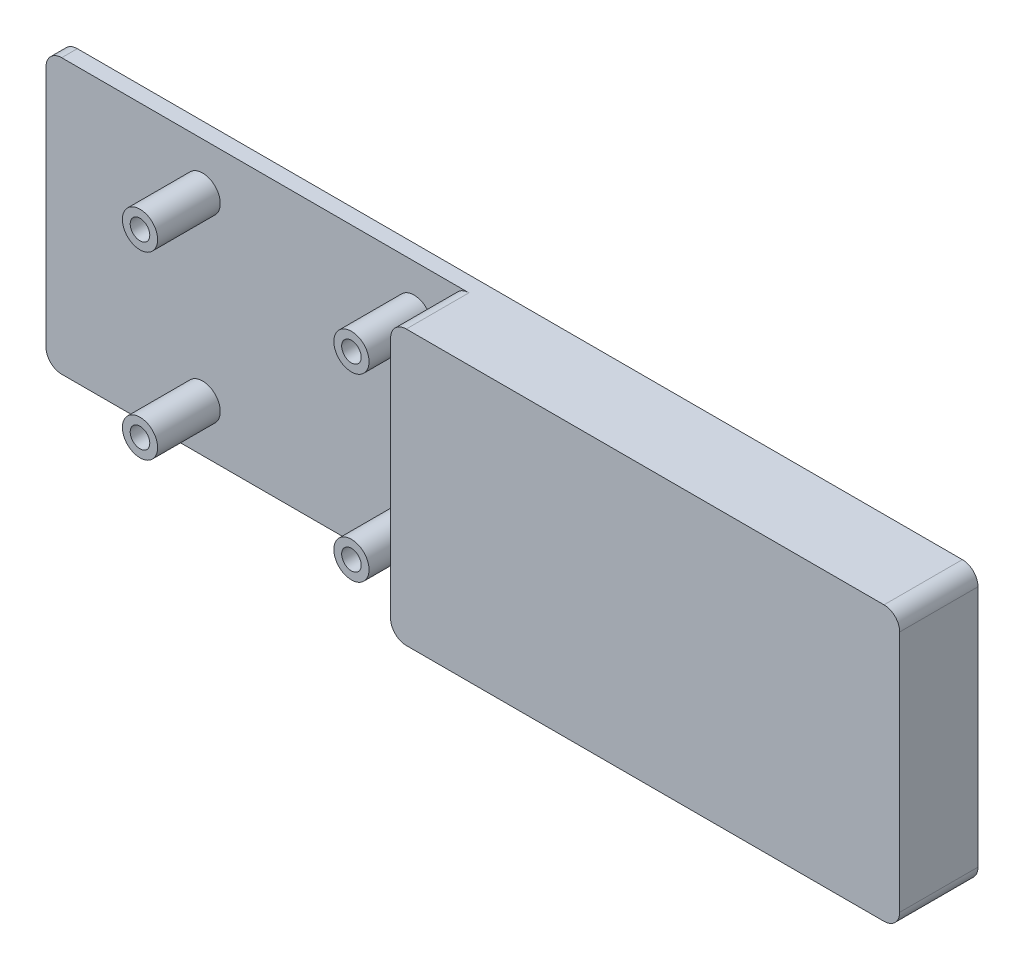
ISO-10303-21;
HEADER;
FILE_DESCRIPTION(('STEP AP214'),'2;1');
FILE_NAME('part.step','',(''),(''),'','','');
FILE_SCHEMA(('AUTOMOTIVE_DESIGN { 1 0 10303 214 1 1 1 1 }'));
ENDSEC;
DATA;
#1=APPLICATION_CONTEXT('core data for automotive mechanical design processes');
#2=APPLICATION_PROTOCOL_DEFINITION('international standard','automotive_design',2000,#1);
#3=PRODUCT_CONTEXT('',#1,'mechanical');
#4=PRODUCT('Part','Part','',(#3));
#5=PRODUCT_RELATED_PRODUCT_CATEGORY('part','',(#4));
#6=PRODUCT_DEFINITION_FORMATION('','',#4);
#7=PRODUCT_DEFINITION_CONTEXT('part definition',#1,'design');
#8=PRODUCT_DEFINITION('design','',#6,#7);
#9=PRODUCT_DEFINITION_SHAPE('','',#8);
#10=(LENGTH_UNIT() NAMED_UNIT(*) SI_UNIT(.MILLI.,.METRE.));
#11=(NAMED_UNIT(*) PLANE_ANGLE_UNIT() SI_UNIT($,.RADIAN.));
#12=(NAMED_UNIT(*) SI_UNIT($,.STERADIAN.) SOLID_ANGLE_UNIT());
#13=UNCERTAINTY_MEASURE_WITH_UNIT(LENGTH_MEASURE(1.E-05),#10,'distance_accuracy_value','');
#14=(GEOMETRIC_REPRESENTATION_CONTEXT(3) GLOBAL_UNCERTAINTY_ASSIGNED_CONTEXT((#13)) GLOBAL_UNIT_ASSIGNED_CONTEXT((#10,
#11,#12)) REPRESENTATION_CONTEXT('',''));
#15=CARTESIAN_POINT('',(0.,0.,0.));
#16=DIRECTION('',(0.,0.,1.));
#17=DIRECTION('',(1.,0.,0.));
#18=AXIS2_PLACEMENT_3D('',#15,#16,#17);
#19=CARTESIAN_POINT('',(0.,0.,2.));
#20=DIRECTION('',(0.,0.,1.));
#21=DIRECTION('',(1.,0.,0.));
#22=AXIS2_PLACEMENT_3D('',#19,#20,#21);
#23=PLANE('',#22);
#24=CARTESIAN_POINT('',(-38.5,11.5,2.));
#25=DIRECTION('',(0.,0.,1.));
#26=DIRECTION('',(1.,0.,0.));
#27=AXIS2_PLACEMENT_3D('',#24,#25,#26);
#28=CIRCLE('',#27,2.25);
#29=CARTESIAN_POINT('',(-36.25,11.5,2.));
#30=VERTEX_POINT('',#29);
#31=EDGE_CURVE('E250',#30,#30,#28,.F.);
#32=ORIENTED_EDGE('',*,*,#31,.T.);
#33=EDGE_LOOP('',(#32));
#34=FACE_BOUND('',#33,.T.);
#35=CARTESIAN_POINT('',(-11.5,11.5,2.));
#36=DIRECTION('',(0.,0.,1.));
#37=DIRECTION('',(1.,0.,0.));
#38=AXIS2_PLACEMENT_3D('',#35,#36,#37);
#39=CIRCLE('',#38,2.25);
#40=CARTESIAN_POINT('',(-9.25,11.5,2.));
#41=VERTEX_POINT('',#40);
#42=EDGE_CURVE('E259',#41,#41,#39,.F.);
#43=ORIENTED_EDGE('',*,*,#42,.T.);
#44=EDGE_LOOP('',(#43));
#45=FACE_BOUND('',#44,.T.);
#46=CARTESIAN_POINT('',(-11.5,-11.5,2.));
#47=DIRECTION('',(0.,0.,1.));
#48=DIRECTION('',(1.,0.,0.));
#49=AXIS2_PLACEMENT_3D('',#46,#47,#48);
#50=CIRCLE('',#49,2.25);
#51=CARTESIAN_POINT('',(-9.25,-11.5,2.));
#52=VERTEX_POINT('',#51);
#53=EDGE_CURVE('E271',#52,#52,#50,.F.);
#54=ORIENTED_EDGE('',*,*,#53,.T.);
#55=EDGE_LOOP('',(#54));
#56=FACE_BOUND('',#55,.T.);
#57=CARTESIAN_POINT('',(-38.5,-11.5,2.));
#58=DIRECTION('',(0.,0.,1.));
#59=DIRECTION('',(1.,0.,0.));
#60=AXIS2_PLACEMENT_3D('',#57,#58,#59);
#61=CIRCLE('',#60,2.25);
#62=CARTESIAN_POINT('',(-36.25,-11.5,2.));
#63=VERTEX_POINT('',#62);
#64=EDGE_CURVE('E179',#63,#63,#61,.T.);
#65=ORIENTED_EDGE('',*,*,#64,.F.);
#66=EDGE_LOOP('',(#65));
#67=FACE_BOUND('',#66,.T.);
#68=DIRECTION('',(-1.,0.,0.));
#69=VECTOR('',#68,1.);
#70=CARTESIAN_POINT('',(0.,17.5,2.));
#71=LINE('',#70,#69);
#72=CARTESIAN_POINT('',(-4.5,17.5,2.));
#73=VERTEX_POINT('',#72);
#74=CARTESIAN_POINT('',(-56.5,17.5,2.));
#75=VERTEX_POINT('',#74);
#76=EDGE_CURVE('E222',#73,#75,#71,.T.);
#77=ORIENTED_EDGE('',*,*,#76,.T.);
#78=CARTESIAN_POINT('',(-56.5,15.5,2.));
#79=DIRECTION('',(0.,0.,1.));
#80=DIRECTION('',(1.,0.,0.));
#81=AXIS2_PLACEMENT_3D('',#78,#79,#80);
#82=CIRCLE('',#81,2.);
#83=CARTESIAN_POINT('',(-58.5,15.5,2.));
#84=VERTEX_POINT('',#83);
#85=EDGE_CURVE('E81',#75,#84,#82,.T.);
#86=ORIENTED_EDGE('',*,*,#85,.T.);
#87=DIRECTION('',(0.,-1.,0.));
#88=VECTOR('',#87,1.);
#89=CARTESIAN_POINT('',(-58.5,0.,2.));
#90=LINE('',#89,#88);
#91=CARTESIAN_POINT('',(-58.5,-15.5,2.));
#92=VERTEX_POINT('',#91);
#93=EDGE_CURVE('E279',#84,#92,#90,.T.);
#94=ORIENTED_EDGE('',*,*,#93,.T.);
#95=CARTESIAN_POINT('',(-56.5,-15.5,2.));
#96=DIRECTION('',(0.,0.,1.));
#97=DIRECTION('',(1.,0.,0.));
#98=AXIS2_PLACEMENT_3D('',#95,#96,#97);
#99=CIRCLE('',#98,2.);
#100=CARTESIAN_POINT('',(-56.5,-17.5,2.));
#101=VERTEX_POINT('',#100);
#102=EDGE_CURVE('E219',#92,#101,#99,.T.);
#103=ORIENTED_EDGE('',*,*,#102,.T.);
#104=DIRECTION('',(-1.,0.,0.));
#105=VECTOR('',#104,1.);
#106=CARTESIAN_POINT('',(0.,-17.5,2.));
#107=LINE('',#106,#105);
#108=CARTESIAN_POINT('',(-4.5,-17.5,2.));
#109=VERTEX_POINT('',#108);
#110=EDGE_CURVE('E152',#109,#101,#107,.T.);
#111=ORIENTED_EDGE('',*,*,#110,.F.);
#112=CARTESIAN_POINT('',(-4.5,-15.5,2.));
#113=DIRECTION('',(0.,0.,1.));
#114=DIRECTION('',(1.,0.,0.));
#115=AXIS2_PLACEMENT_3D('',#112,#113,#114);
#116=CIRCLE('',#115,2.);
#117=CARTESIAN_POINT('',(-6.5,-15.5,2.));
#118=VERTEX_POINT('',#117);
#119=EDGE_CURVE('E12',#109,#118,#116,.F.);
#120=ORIENTED_EDGE('',*,*,#119,.T.);
#121=DIRECTION('',(0.,1.,0.));
#122=VECTOR('',#121,1.);
#123=CARTESIAN_POINT('',(-6.5,0.,2.));
#124=LINE('',#123,#122);
#125=CARTESIAN_POINT('',(-6.5,15.5,2.));
#126=VERTEX_POINT('',#125);
#127=EDGE_CURVE('E150',#118,#126,#124,.T.);
#128=ORIENTED_EDGE('',*,*,#127,.T.);
#129=CARTESIAN_POINT('',(-4.5,15.5,2.));
#130=DIRECTION('',(0.,0.,1.));
#131=DIRECTION('',(1.,0.,0.));
#132=AXIS2_PLACEMENT_3D('',#129,#130,#131);
#133=CIRCLE('',#132,2.);
#134=EDGE_CURVE('E67',#126,#73,#133,.F.);
#135=ORIENTED_EDGE('',*,*,#134,.T.);
#136=EDGE_LOOP('',(#77,#86,#94,#103,#111,#120,#128,#135));
#137=FACE_BOUND('',#136,.T.);
#138=ADVANCED_FACE('F59',(#34,#45,#56,#67,#137),#23,.T.);
#139=CARTESIAN_POINT('',(-38.5,-11.5,10.));
#140=DIRECTION('',(0.,0.,-1.));
#141=DIRECTION('',(-1.,0.,0.));
#142=AXIS2_PLACEMENT_3D('',#139,#140,#141);
#143=CYLINDRICAL_SURFACE('',#142,1.25);
#144=CARTESIAN_POINT('',(-38.5,-11.5,2.));
#145=DIRECTION('',(0.,0.,1.));
#146=DIRECTION('',(1.,0.,0.));
#147=AXIS2_PLACEMENT_3D('',#144,#145,#146);
#148=CIRCLE('',#147,1.25);
#149=CARTESIAN_POINT('',(-37.25,-11.5,2.));
#150=VERTEX_POINT('',#149);
#151=EDGE_CURVE('E277',#150,#150,#148,.T.);
#152=ORIENTED_EDGE('',*,*,#151,.F.);
#153=EDGE_LOOP('',(#152));
#154=FACE_BOUND('',#153,.T.);
#155=CARTESIAN_POINT('',(-38.5,-11.5,10.));
#156=DIRECTION('',(0.,0.,1.));
#157=DIRECTION('',(1.,0.,0.));
#158=AXIS2_PLACEMENT_3D('',#155,#156,#157);
#159=CIRCLE('',#158,1.25);
#160=CARTESIAN_POINT('',(-37.25,-11.5,10.));
#161=VERTEX_POINT('',#160);
#162=EDGE_CURVE('E295',#161,#161,#159,.T.);
#163=ORIENTED_EDGE('',*,*,#162,.T.);
#164=EDGE_LOOP('',(#163));
#165=FACE_BOUND('',#164,.T.);
#166=ADVANCED_FACE('F304',(#154,#165),#143,.F.);
#167=CARTESIAN_POINT('',(-38.5,-11.5,10.));
#168=DIRECTION('',(0.,0.,-1.));
#169=DIRECTION('',(-1.,0.,0.));
#170=AXIS2_PLACEMENT_3D('',#167,#168,#169);
#171=CYLINDRICAL_SURFACE('',#170,2.25);
#172=ORIENTED_EDGE('',*,*,#64,.T.);
#173=EDGE_LOOP('',(#172));
#174=FACE_BOUND('',#173,.T.);
#175=CARTESIAN_POINT('',(-38.5,-11.5,10.));
#176=DIRECTION('',(0.,0.,1.));
#177=DIRECTION('',(1.,0.,0.));
#178=AXIS2_PLACEMENT_3D('',#175,#176,#177);
#179=CIRCLE('',#178,2.25);
#180=CARTESIAN_POINT('',(-36.25,-11.5,10.));
#181=VERTEX_POINT('',#180);
#182=EDGE_CURVE('E294',#181,#181,#179,.T.);
#183=ORIENTED_EDGE('',*,*,#182,.F.);
#184=EDGE_LOOP('',(#183));
#185=FACE_BOUND('',#184,.T.);
#186=ADVANCED_FACE('F302',(#174,#185),#171,.T.);
#187=CARTESIAN_POINT('',(0.,0.,10.));
#188=DIRECTION('',(0.,0.,1.));
#189=DIRECTION('',(1.,0.,0.));
#190=AXIS2_PLACEMENT_3D('',#187,#188,#189);
#191=PLANE('',#190);
#192=ORIENTED_EDGE('',*,*,#162,.F.);
#193=EDGE_LOOP('',(#192));
#194=FACE_BOUND('',#193,.T.);
#195=ORIENTED_EDGE('',*,*,#182,.T.);
#196=EDGE_LOOP('',(#195));
#197=FACE_BOUND('',#196,.T.);
#198=ADVANCED_FACE('F300',(#194,#197),#191,.T.);
#199=CARTESIAN_POINT('',(0.,-17.5,2.));
#200=DIRECTION('',(0.,-1.,0.));
#201=DIRECTION('',(0.,0.,-1.));
#202=AXIS2_PLACEMENT_3D('',#199,#200,#201);
#203=PLANE('',#202);
#204=DIRECTION('',(-1.,0.,0.));
#205=VECTOR('',#204,1.);
#206=CARTESIAN_POINT('',(0.,-17.5,9.99999999999999));
#207=LINE('',#206,#205);
#208=CARTESIAN_POINT('',(56.5,-17.5,9.99999999999999));
#209=VERTEX_POINT('',#208);
#210=CARTESIAN_POINT('',(-4.5,-17.5,9.99999999999999));
#211=VERTEX_POINT('',#210);
#212=EDGE_CURVE('E240',#209,#211,#207,.T.);
#213=ORIENTED_EDGE('',*,*,#212,.T.);
#214=DIRECTION('',(0.,0.,-1.));
#215=VECTOR('',#214,1.);
#216=CARTESIAN_POINT('',(-4.5,-17.5,2.));
#217=LINE('',#216,#215);
#218=EDGE_CURVE('E200',#211,#109,#217,.T.);
#219=ORIENTED_EDGE('',*,*,#218,.T.);
#220=ORIENTED_EDGE('',*,*,#110,.T.);
#221=DIRECTION('',(0.,0.,-1.));
#222=VECTOR('',#221,1.);
#223=CARTESIAN_POINT('',(-56.5,-17.5,0.));
#224=LINE('',#223,#222);
#225=CARTESIAN_POINT('',(-56.5,-17.5,0.));
#226=VERTEX_POINT('',#225);
#227=EDGE_CURVE('E195',#101,#226,#224,.T.);
#228=ORIENTED_EDGE('',*,*,#227,.T.);
#229=DIRECTION('',(-1.,0.,0.));
#230=VECTOR('',#229,1.);
#231=CARTESIAN_POINT('',(0.,-17.5,0.));
#232=LINE('',#231,#230);
#233=CARTESIAN_POINT('',(56.5,-17.5,0.));
#234=VERTEX_POINT('',#233);
#235=EDGE_CURVE('E287',#234,#226,#232,.T.);
#236=ORIENTED_EDGE('',*,*,#235,.F.);
#237=DIRECTION('',(0.,0.,-1.));
#238=VECTOR('',#237,1.);
#239=CARTESIAN_POINT('',(56.5,-17.5,2.));
#240=LINE('',#239,#238);
#241=EDGE_CURVE('E198',#234,#209,#240,.F.);
#242=ORIENTED_EDGE('',*,*,#241,.T.);
#243=EDGE_LOOP('',(#213,#219,#220,#228,#236,#242));
#244=FACE_BOUND('',#243,.T.);
#245=ADVANCED_FACE('F311',(#244),#203,.T.);
#246=CARTESIAN_POINT('',(58.5,0.,2.));
#247=DIRECTION('',(1.,0.,0.));
#248=DIRECTION('',(0.,0.,-1.));
#249=AXIS2_PLACEMENT_3D('',#246,#247,#248);
#250=PLANE('',#249);
#251=DIRECTION('',(0.,-1.,0.));
#252=VECTOR('',#251,1.);
#253=CARTESIAN_POINT('',(58.5,0.,0.));
#254=LINE('',#253,#252);
#255=CARTESIAN_POINT('',(58.5,15.5,0.));
#256=VERTEX_POINT('',#255);
#257=CARTESIAN_POINT('',(58.5,-15.5,0.));
#258=VERTEX_POINT('',#257);
#259=EDGE_CURVE('E280',#256,#258,#254,.T.);
#260=ORIENTED_EDGE('',*,*,#259,.F.);
#261=DIRECTION('',(0.,0.,-1.));
#262=VECTOR('',#261,1.);
#263=CARTESIAN_POINT('',(58.5,15.5,9.99999999999999));
#264=LINE('',#263,#262);
#265=CARTESIAN_POINT('',(58.5,15.5,9.99999999999999));
#266=VERTEX_POINT('',#265);
#267=EDGE_CURVE('E213',#256,#266,#264,.F.);
#268=ORIENTED_EDGE('',*,*,#267,.T.);
#269=DIRECTION('',(0.,-1.,0.));
#270=VECTOR('',#269,1.);
#271=CARTESIAN_POINT('',(58.5,0.,9.99999999999999));
#272=LINE('',#271,#270);
#273=CARTESIAN_POINT('',(58.5,-15.5,9.99999999999999));
#274=VERTEX_POINT('',#273);
#275=EDGE_CURVE('E236',#266,#274,#272,.T.);
#276=ORIENTED_EDGE('',*,*,#275,.T.);
#277=DIRECTION('',(0.,0.,-1.));
#278=VECTOR('',#277,1.);
#279=CARTESIAN_POINT('',(58.5,-15.5,2.));
#280=LINE('',#279,#278);
#281=EDGE_CURVE('E210',#274,#258,#280,.T.);
#282=ORIENTED_EDGE('',*,*,#281,.T.);
#283=EDGE_LOOP('',(#260,#268,#276,#282));
#284=FACE_BOUND('',#283,.T.);
#285=ADVANCED_FACE('F478',(#284),#250,.T.);
#286=CARTESIAN_POINT('',(0.,17.5,2.));
#287=DIRECTION('',(0.,-1.,0.));
#288=DIRECTION('',(0.,0.,-1.));
#289=AXIS2_PLACEMENT_3D('',#286,#287,#288);
#290=PLANE('',#289);
#291=ORIENTED_EDGE('',*,*,#76,.F.);
#292=DIRECTION('',(0.,0.,-1.));
#293=VECTOR('',#292,1.);
#294=CARTESIAN_POINT('',(-4.5,17.5,2.));
#295=LINE('',#294,#293);
#296=CARTESIAN_POINT('',(-4.5,17.5,9.99999999999999));
#297=VERTEX_POINT('',#296);
#298=EDGE_CURVE('E186',#73,#297,#295,.F.);
#299=ORIENTED_EDGE('',*,*,#298,.T.);
#300=DIRECTION('',(-1.,0.,0.));
#301=VECTOR('',#300,1.);
#302=CARTESIAN_POINT('',(0.,17.5,9.99999999999999));
#303=LINE('',#302,#301);
#304=CARTESIAN_POINT('',(56.5,17.5,9.99999999999999));
#305=VERTEX_POINT('',#304);
#306=EDGE_CURVE('E230',#305,#297,#303,.T.);
#307=ORIENTED_EDGE('',*,*,#306,.F.);
#308=DIRECTION('',(0.,0.,-1.));
#309=VECTOR('',#308,1.);
#310=CARTESIAN_POINT('',(56.5,17.5,0.));
#311=LINE('',#310,#309);
#312=CARTESIAN_POINT('',(56.5,17.5,0.));
#313=VERTEX_POINT('',#312);
#314=EDGE_CURVE('E183',#305,#313,#311,.T.);
#315=ORIENTED_EDGE('',*,*,#314,.T.);
#316=DIRECTION('',(-1.,0.,0.));
#317=VECTOR('',#316,1.);
#318=CARTESIAN_POINT('',(0.,17.5,0.));
#319=LINE('',#318,#317);
#320=CARTESIAN_POINT('',(-56.5,17.5,0.));
#321=VERTEX_POINT('',#320);
#322=EDGE_CURVE('E274',#313,#321,#319,.T.);
#323=ORIENTED_EDGE('',*,*,#322,.T.);
#324=DIRECTION('',(0.,0.,-1.));
#325=VECTOR('',#324,1.);
#326=CARTESIAN_POINT('',(-56.5,17.5,2.));
#327=LINE('',#326,#325);
#328=EDGE_CURVE('E173',#321,#75,#327,.F.);
#329=ORIENTED_EDGE('',*,*,#328,.T.);
#330=EDGE_LOOP('',(#291,#299,#307,#315,#323,#329));
#331=FACE_BOUND('',#330,.T.);
#332=ADVANCED_FACE('F229',(#331),#290,.F.);
#333=CARTESIAN_POINT('',(-58.5,0.,2.));
#334=DIRECTION('',(1.,0.,0.));
#335=DIRECTION('',(0.,0.,-1.));
#336=AXIS2_PLACEMENT_3D('',#333,#334,#335);
#337=PLANE('',#336);
#338=ORIENTED_EDGE('',*,*,#93,.F.);
#339=DIRECTION('',(0.,0.,-1.));
#340=VECTOR('',#339,1.);
#341=CARTESIAN_POINT('',(-58.5,15.5,2.));
#342=LINE('',#341,#340);
#343=CARTESIAN_POINT('',(-58.5,15.5,0.));
#344=VERTEX_POINT('',#343);
#345=EDGE_CURVE('E216',#84,#344,#342,.T.);
#346=ORIENTED_EDGE('',*,*,#345,.T.);
#347=DIRECTION('',(0.,-1.,0.));
#348=VECTOR('',#347,1.);
#349=CARTESIAN_POINT('',(-58.5,0.,0.));
#350=LINE('',#349,#348);
#351=CARTESIAN_POINT('',(-58.5,-15.5,0.));
#352=VERTEX_POINT('',#351);
#353=EDGE_CURVE('E285',#344,#352,#350,.T.);
#354=ORIENTED_EDGE('',*,*,#353,.T.);
#355=DIRECTION('',(0.,0.,-1.));
#356=VECTOR('',#355,1.);
#357=CARTESIAN_POINT('',(-58.5,-15.5,2.));
#358=LINE('',#357,#356);
#359=EDGE_CURVE('E74',#352,#92,#358,.F.);
#360=ORIENTED_EDGE('',*,*,#359,.T.);
#361=EDGE_LOOP('',(#338,#346,#354,#360));
#362=FACE_BOUND('',#361,.T.);
#363=ADVANCED_FACE('F343',(#362),#337,.F.);
#364=CARTESIAN_POINT('',(0.,0.,0.));
#365=DIRECTION('',(0.,0.,1.));
#366=DIRECTION('',(1.,0.,0.));
#367=AXIS2_PLACEMENT_3D('',#364,#365,#366);
#368=PLANE('',#367);
#369=ORIENTED_EDGE('',*,*,#322,.F.);
#370=CARTESIAN_POINT('',(56.5,15.5,0.));
#371=DIRECTION('',(0.,0.,1.));
#372=DIRECTION('',(1.,0.,0.));
#373=AXIS2_PLACEMENT_3D('',#370,#371,#372);
#374=CIRCLE('',#373,2.);
#375=EDGE_CURVE('E208',#313,#256,#374,.F.);
#376=ORIENTED_EDGE('',*,*,#375,.T.);
#377=ORIENTED_EDGE('',*,*,#259,.T.);
#378=CARTESIAN_POINT('',(56.5,-15.5,0.));
#379=DIRECTION('',(0.,0.,1.));
#380=DIRECTION('',(1.,0.,0.));
#381=AXIS2_PLACEMENT_3D('',#378,#379,#380);
#382=CIRCLE('',#381,2.);
#383=EDGE_CURVE('E206',#258,#234,#382,.F.);
#384=ORIENTED_EDGE('',*,*,#383,.T.);
#385=ORIENTED_EDGE('',*,*,#235,.T.);
#386=CARTESIAN_POINT('',(-56.5,-15.5,0.));
#387=DIRECTION('',(0.,0.,1.));
#388=DIRECTION('',(1.,0.,0.));
#389=AXIS2_PLACEMENT_3D('',#386,#387,#388);
#390=CIRCLE('',#389,2.);
#391=EDGE_CURVE('E202',#226,#352,#390,.F.);
#392=ORIENTED_EDGE('',*,*,#391,.T.);
#393=ORIENTED_EDGE('',*,*,#353,.F.);
#394=CARTESIAN_POINT('',(-56.5,15.5,0.));
#395=DIRECTION('',(0.,0.,1.));
#396=DIRECTION('',(1.,0.,0.));
#397=AXIS2_PLACEMENT_3D('',#394,#395,#396);
#398=CIRCLE('',#397,2.);
#399=EDGE_CURVE('E204',#344,#321,#398,.F.);
#400=ORIENTED_EDGE('',*,*,#399,.T.);
#401=EDGE_LOOP('',(#369,#376,#377,#384,#385,#392,#393,#400));
#402=FACE_BOUND('',#401,.T.);
#403=ADVANCED_FACE('F334',(#402),#368,.F.);
#404=ORIENTED_EDGE('',*,*,#151,.T.);
#405=EDGE_LOOP('',(#404));
#406=FACE_BOUND('',#405,.T.);
#407=ADVANCED_FACE('F322',(#406),#23,.T.);
#408=CARTESIAN_POINT('',(-11.5,-11.5,10.));
#409=DIRECTION('',(0.,0.,-1.));
#410=DIRECTION('',(-1.,0.,0.));
#411=AXIS2_PLACEMENT_3D('',#408,#409,#410);
#412=CYLINDRICAL_SURFACE('',#411,1.25);
#413=CARTESIAN_POINT('',(-11.5,-11.5,2.));
#414=DIRECTION('',(0.,0.,1.));
#415=DIRECTION('',(1.,0.,0.));
#416=AXIS2_PLACEMENT_3D('',#413,#414,#415);
#417=CIRCLE('',#416,1.25);
#418=CARTESIAN_POINT('',(-10.25,-11.5,2.));
#419=VERTEX_POINT('',#418);
#420=EDGE_CURVE('E265',#419,#419,#417,.F.);
#421=ORIENTED_EDGE('',*,*,#420,.T.);
#422=EDGE_LOOP('',(#421));
#423=FACE_BOUND('',#422,.T.);
#424=CARTESIAN_POINT('',(-11.5,-11.5,10.));
#425=DIRECTION('',(0.,0.,1.));
#426=DIRECTION('',(1.,0.,0.));
#427=AXIS2_PLACEMENT_3D('',#424,#425,#426);
#428=CIRCLE('',#427,1.25);
#429=CARTESIAN_POINT('',(-10.25,-11.5,10.));
#430=VERTEX_POINT('',#429);
#431=EDGE_CURVE('E262',#430,#430,#428,.T.);
#432=ORIENTED_EDGE('',*,*,#431,.T.);
#433=EDGE_LOOP('',(#432));
#434=FACE_BOUND('',#433,.T.);
#435=ADVANCED_FACE('F333',(#423,#434),#412,.F.);
#436=CARTESIAN_POINT('',(-11.5,-11.5,10.));
#437=DIRECTION('',(0.,0.,-1.));
#438=DIRECTION('',(-1.,0.,0.));
#439=AXIS2_PLACEMENT_3D('',#436,#437,#438);
#440=CYLINDRICAL_SURFACE('',#439,2.25);
#441=ORIENTED_EDGE('',*,*,#53,.F.);
#442=EDGE_LOOP('',(#441));
#443=FACE_BOUND('',#442,.T.);
#444=CARTESIAN_POINT('',(-11.5,-11.5,10.));
#445=DIRECTION('',(0.,0.,1.));
#446=DIRECTION('',(1.,0.,0.));
#447=AXIS2_PLACEMENT_3D('',#444,#445,#446);
#448=CIRCLE('',#447,2.25);
#449=CARTESIAN_POINT('',(-9.25,-11.5,10.));
#450=VERTEX_POINT('',#449);
#451=EDGE_CURVE('E268',#450,#450,#448,.T.);
#452=ORIENTED_EDGE('',*,*,#451,.F.);
#453=EDGE_LOOP('',(#452));
#454=FACE_BOUND('',#453,.T.);
#455=ADVANCED_FACE('F341',(#443,#454),#440,.T.);
#456=CARTESIAN_POINT('',(0.,0.,10.));
#457=DIRECTION('',(0.,0.,1.));
#458=DIRECTION('',(1.,0.,0.));
#459=AXIS2_PLACEMENT_3D('',#456,#457,#458);
#460=PLANE('',#459);
#461=ORIENTED_EDGE('',*,*,#431,.F.);
#462=EDGE_LOOP('',(#461));
#463=FACE_BOUND('',#462,.T.);
#464=ORIENTED_EDGE('',*,*,#451,.T.);
#465=EDGE_LOOP('',(#464));
#466=FACE_BOUND('',#465,.T.);
#467=ADVANCED_FACE('F347',(#463,#466),#460,.T.);
#468=ORIENTED_EDGE('',*,*,#420,.F.);
#469=EDGE_LOOP('',(#468));
#470=FACE_BOUND('',#469,.T.);
#471=ADVANCED_FACE('F336',(#470),#23,.T.);
#472=CARTESIAN_POINT('',(-11.5,11.5,10.));
#473=DIRECTION('',(0.,0.,-1.));
#474=DIRECTION('',(-1.,0.,0.));
#475=AXIS2_PLACEMENT_3D('',#472,#473,#474);
#476=CYLINDRICAL_SURFACE('',#475,1.25);
#477=CARTESIAN_POINT('',(-11.5,11.5,2.));
#478=DIRECTION('',(0.,0.,1.));
#479=DIRECTION('',(1.,0.,0.));
#480=AXIS2_PLACEMENT_3D('',#477,#478,#479);
#481=CIRCLE('',#480,1.25);
#482=CARTESIAN_POINT('',(-10.25,11.5,2.));
#483=VERTEX_POINT('',#482);
#484=EDGE_CURVE('E176',#483,#483,#481,.F.);
#485=ORIENTED_EDGE('',*,*,#484,.T.);
#486=EDGE_LOOP('',(#485));
#487=FACE_BOUND('',#486,.T.);
#488=CARTESIAN_POINT('',(-11.5,11.5,10.));
#489=DIRECTION('',(0.,0.,1.));
#490=DIRECTION('',(1.,0.,0.));
#491=AXIS2_PLACEMENT_3D('',#488,#489,#490);
#492=CIRCLE('',#491,1.25);
#493=CARTESIAN_POINT('',(-10.25,11.5,10.));
#494=VERTEX_POINT('',#493);
#495=EDGE_CURVE('E252',#494,#494,#492,.T.);
#496=ORIENTED_EDGE('',*,*,#495,.T.);
#497=EDGE_LOOP('',(#496));
#498=FACE_BOUND('',#497,.T.);
#499=ADVANCED_FACE('F346',(#487,#498),#476,.F.);
#500=CARTESIAN_POINT('',(-11.5,11.5,10.));
#501=DIRECTION('',(0.,0.,-1.));
#502=DIRECTION('',(-1.,0.,0.));
#503=AXIS2_PLACEMENT_3D('',#500,#501,#502);
#504=CYLINDRICAL_SURFACE('',#503,2.25);
#505=ORIENTED_EDGE('',*,*,#42,.F.);
#506=EDGE_LOOP('',(#505));
#507=FACE_BOUND('',#506,.T.);
#508=CARTESIAN_POINT('',(-11.5,11.5,10.));
#509=DIRECTION('',(0.,0.,1.));
#510=DIRECTION('',(1.,0.,0.));
#511=AXIS2_PLACEMENT_3D('',#508,#509,#510);
#512=CIRCLE('',#511,2.25);
#513=CARTESIAN_POINT('',(-9.25,11.5,10.));
#514=VERTEX_POINT('',#513);
#515=EDGE_CURVE('E256',#514,#514,#512,.T.);
#516=ORIENTED_EDGE('',*,*,#515,.F.);
#517=EDGE_LOOP('',(#516));
#518=FACE_BOUND('',#517,.T.);
#519=ADVANCED_FACE('F353',(#507,#518),#504,.T.);
#520=CARTESIAN_POINT('',(0.,0.,10.));
#521=DIRECTION('',(0.,0.,1.));
#522=DIRECTION('',(1.,0.,0.));
#523=AXIS2_PLACEMENT_3D('',#520,#521,#522);
#524=PLANE('',#523);
#525=ORIENTED_EDGE('',*,*,#495,.F.);
#526=EDGE_LOOP('',(#525));
#527=FACE_BOUND('',#526,.T.);
#528=ORIENTED_EDGE('',*,*,#515,.T.);
#529=EDGE_LOOP('',(#528));
#530=FACE_BOUND('',#529,.T.);
#531=ADVANCED_FACE('F361',(#527,#530),#524,.T.);
#532=ORIENTED_EDGE('',*,*,#484,.F.);
#533=EDGE_LOOP('',(#532));
#534=FACE_BOUND('',#533,.T.);
#535=ADVANCED_FACE('F331',(#534),#23,.T.);
#536=CARTESIAN_POINT('',(-38.5,11.5,10.));
#537=DIRECTION('',(0.,0.,-1.));
#538=DIRECTION('',(-1.,0.,0.));
#539=AXIS2_PLACEMENT_3D('',#536,#537,#538);
#540=CYLINDRICAL_SURFACE('',#539,1.25);
#541=CARTESIAN_POINT('',(-38.5,11.5,2.));
#542=DIRECTION('',(0.,0.,1.));
#543=DIRECTION('',(1.,0.,0.));
#544=AXIS2_PLACEMENT_3D('',#541,#542,#543);
#545=CIRCLE('',#544,1.25);
#546=CARTESIAN_POINT('',(-37.25,11.5,2.));
#547=VERTEX_POINT('',#546);
#548=EDGE_CURVE('E171',#547,#547,#545,.F.);
#549=ORIENTED_EDGE('',*,*,#548,.T.);
#550=EDGE_LOOP('',(#549));
#551=FACE_BOUND('',#550,.T.);
#552=CARTESIAN_POINT('',(-38.5,11.5,10.));
#553=DIRECTION('',(0.,0.,1.));
#554=DIRECTION('',(1.,0.,0.));
#555=AXIS2_PLACEMENT_3D('',#552,#553,#554);
#556=CIRCLE('',#555,1.25);
#557=CARTESIAN_POINT('',(-37.25,11.5,10.));
#558=VERTEX_POINT('',#557);
#559=EDGE_CURVE('E165',#558,#558,#556,.T.);
#560=ORIENTED_EDGE('',*,*,#559,.T.);
#561=EDGE_LOOP('',(#560));
#562=FACE_BOUND('',#561,.T.);
#563=ADVANCED_FACE('F360',(#551,#562),#540,.F.);
#564=CARTESIAN_POINT('',(-38.5,11.5,10.));
#565=DIRECTION('',(0.,0.,-1.));
#566=DIRECTION('',(-1.,0.,0.));
#567=AXIS2_PLACEMENT_3D('',#564,#565,#566);
#568=CYLINDRICAL_SURFACE('',#567,2.25);
#569=ORIENTED_EDGE('',*,*,#31,.F.);
#570=EDGE_LOOP('',(#569));
#571=FACE_BOUND('',#570,.T.);
#572=CARTESIAN_POINT('',(-38.5,11.5,10.));
#573=DIRECTION('',(0.,0.,1.));
#574=DIRECTION('',(1.,0.,0.));
#575=AXIS2_PLACEMENT_3D('',#572,#573,#574);
#576=CIRCLE('',#575,2.25);
#577=CARTESIAN_POINT('',(-36.25,11.5,10.));
#578=VERTEX_POINT('',#577);
#579=EDGE_CURVE('E247',#578,#578,#576,.T.);
#580=ORIENTED_EDGE('',*,*,#579,.F.);
#581=EDGE_LOOP('',(#580));
#582=FACE_BOUND('',#581,.T.);
#583=ADVANCED_FACE('F367',(#571,#582),#568,.T.);
#584=CARTESIAN_POINT('',(0.,0.,10.));
#585=DIRECTION('',(0.,0.,1.));
#586=DIRECTION('',(1.,0.,0.));
#587=AXIS2_PLACEMENT_3D('',#584,#585,#586);
#588=PLANE('',#587);
#589=ORIENTED_EDGE('',*,*,#559,.F.);
#590=EDGE_LOOP('',(#589));
#591=FACE_BOUND('',#590,.T.);
#592=ORIENTED_EDGE('',*,*,#579,.T.);
#593=EDGE_LOOP('',(#592));
#594=FACE_BOUND('',#593,.T.);
#595=ADVANCED_FACE('F329',(#591,#594),#588,.T.);
#596=ORIENTED_EDGE('',*,*,#548,.F.);
#597=EDGE_LOOP('',(#596));
#598=FACE_BOUND('',#597,.T.);
#599=ADVANCED_FACE('F321',(#598),#23,.T.);
#600=CARTESIAN_POINT('',(-6.5,0.,83.824115301167));
#601=DIRECTION('',(1.,0.,0.));
#602=DIRECTION('',(0.,1.,0.));
#603=AXIS2_PLACEMENT_3D('',#600,#601,#602);
#604=PLANE('',#603);
#605=DIRECTION('',(0.,-1.,0.));
#606=VECTOR('',#605,1.);
#607=CARTESIAN_POINT('',(-6.5,0.,9.99999999999999));
#608=LINE('',#607,#606);
#609=CARTESIAN_POINT('',(-6.5,15.5,9.99999999999999));
#610=VERTEX_POINT('',#609);
#611=CARTESIAN_POINT('',(-6.5,-15.5,9.99999999999999));
#612=VERTEX_POINT('',#611);
#613=EDGE_CURVE('E166',#610,#612,#608,.T.);
#614=ORIENTED_EDGE('',*,*,#613,.F.);
#615=DIRECTION('',(0.,0.,-1.));
#616=VECTOR('',#615,1.);
#617=CARTESIAN_POINT('',(-6.5,15.5,83.824115301167));
#618=LINE('',#617,#616);
#619=EDGE_CURVE('E164',#610,#126,#618,.T.);
#620=ORIENTED_EDGE('',*,*,#619,.T.);
#621=ORIENTED_EDGE('',*,*,#127,.F.);
#622=DIRECTION('',(0.,0.,-1.));
#623=VECTOR('',#622,1.);
#624=CARTESIAN_POINT('',(-6.5,-15.5,9.99999999999999));
#625=LINE('',#624,#623);
#626=EDGE_CURVE('E161',#118,#612,#625,.F.);
#627=ORIENTED_EDGE('',*,*,#626,.T.);
#628=EDGE_LOOP('',(#614,#620,#621,#627));
#629=FACE_BOUND('',#628,.T.);
#630=ADVANCED_FACE('F160',(#629),#604,.F.);
#631=CARTESIAN_POINT('',(0.,0.,10.));
#632=DIRECTION('',(0.,0.,1.));
#633=DIRECTION('',(1.,0.,0.));
#634=AXIS2_PLACEMENT_3D('',#631,#632,#633);
#635=PLANE('',#634);
#636=ORIENTED_EDGE('',*,*,#306,.T.);
#637=CARTESIAN_POINT('',(-4.5,15.5,9.99999999999999));
#638=DIRECTION('',(0.,0.,1.));
#639=DIRECTION('',(1.,0.,0.));
#640=AXIS2_PLACEMENT_3D('',#637,#638,#639);
#641=CIRCLE('',#640,2.);
#642=EDGE_CURVE('E193',#297,#610,#641,.T.);
#643=ORIENTED_EDGE('',*,*,#642,.T.);
#644=ORIENTED_EDGE('',*,*,#613,.T.);
#645=CARTESIAN_POINT('',(-4.5,-15.5,10.));
#646=DIRECTION('',(0.,0.,1.));
#647=DIRECTION('',(1.,0.,0.));
#648=AXIS2_PLACEMENT_3D('',#645,#646,#647);
#649=CIRCLE('',#648,2.);
#650=EDGE_CURVE('E170',#612,#211,#649,.T.);
#651=ORIENTED_EDGE('',*,*,#650,.T.);
#652=ORIENTED_EDGE('',*,*,#212,.F.);
#653=CARTESIAN_POINT('',(56.5,-15.5,10.));
#654=DIRECTION('',(0.,0.,1.));
#655=DIRECTION('',(1.,0.,0.));
#656=AXIS2_PLACEMENT_3D('',#653,#654,#655);
#657=CIRCLE('',#656,2.);
#658=EDGE_CURVE('E188',#209,#274,#657,.T.);
#659=ORIENTED_EDGE('',*,*,#658,.T.);
#660=ORIENTED_EDGE('',*,*,#275,.F.);
#661=CARTESIAN_POINT('',(56.5,15.5,10.));
#662=DIRECTION('',(0.,0.,1.));
#663=DIRECTION('',(1.,0.,0.));
#664=AXIS2_PLACEMENT_3D('',#661,#662,#663);
#665=CIRCLE('',#664,2.);
#666=EDGE_CURVE('E190',#266,#305,#665,.T.);
#667=ORIENTED_EDGE('',*,*,#666,.T.);
#668=EDGE_LOOP('',(#636,#643,#644,#651,#652,#659,#660,#667));
#669=FACE_BOUND('',#668,.T.);
#670=ADVANCED_FACE('F233',(#669),#635,.T.);
#671=CARTESIAN_POINT('',(-4.5,15.5,83.824115301167));
#672=DIRECTION('',(0.,0.,-1.));
#673=DIRECTION('',(-1.,0.,0.));
#674=AXIS2_PLACEMENT_3D('',#671,#672,#673);
#675=CYLINDRICAL_SURFACE('',#674,2.);
#676=ORIENTED_EDGE('',*,*,#642,.F.);
#677=ORIENTED_EDGE('',*,*,#298,.F.);
#678=ORIENTED_EDGE('',*,*,#134,.F.);
#679=ORIENTED_EDGE('',*,*,#619,.F.);
#680=EDGE_LOOP('',(#676,#677,#678,#679));
#681=FACE_BOUND('',#680,.T.);
#682=ADVANCED_FACE('F225',(#681),#675,.T.);
#683=CARTESIAN_POINT('',(-4.5,-15.5,2.));
#684=DIRECTION('',(0.,0.,1.));
#685=DIRECTION('',(1.,0.,0.));
#686=AXIS2_PLACEMENT_3D('',#683,#684,#685);
#687=CYLINDRICAL_SURFACE('',#686,2.);
#688=ORIENTED_EDGE('',*,*,#650,.F.);
#689=ORIENTED_EDGE('',*,*,#626,.F.);
#690=ORIENTED_EDGE('',*,*,#119,.F.);
#691=ORIENTED_EDGE('',*,*,#218,.F.);
#692=EDGE_LOOP('',(#688,#689,#690,#691));
#693=FACE_BOUND('',#692,.T.);
#694=ADVANCED_FACE('F169',(#693),#687,.T.);
#695=CARTESIAN_POINT('',(56.5,15.5,2.));
#696=DIRECTION('',(0.,0.,1.));
#697=DIRECTION('',(1.,0.,0.));
#698=AXIS2_PLACEMENT_3D('',#695,#696,#697);
#699=CYLINDRICAL_SURFACE('',#698,2.);
#700=ORIENTED_EDGE('',*,*,#666,.F.);
#701=ORIENTED_EDGE('',*,*,#267,.F.);
#702=ORIENTED_EDGE('',*,*,#375,.F.);
#703=ORIENTED_EDGE('',*,*,#314,.F.);
#704=EDGE_LOOP('',(#700,#701,#702,#703));
#705=FACE_BOUND('',#704,.T.);
#706=ADVANCED_FACE('F548',(#705),#699,.T.);
#707=CARTESIAN_POINT('',(56.5,-15.5,2.));
#708=DIRECTION('',(0.,0.,-1.));
#709=DIRECTION('',(-1.,0.,0.));
#710=AXIS2_PLACEMENT_3D('',#707,#708,#709);
#711=CYLINDRICAL_SURFACE('',#710,2.);
#712=ORIENTED_EDGE('',*,*,#658,.F.);
#713=ORIENTED_EDGE('',*,*,#241,.F.);
#714=ORIENTED_EDGE('',*,*,#383,.F.);
#715=ORIENTED_EDGE('',*,*,#281,.F.);
#716=EDGE_LOOP('',(#712,#713,#714,#715));
#717=FACE_BOUND('',#716,.T.);
#718=ADVANCED_FACE('F557',(#717),#711,.T.);
#719=CARTESIAN_POINT('',(-56.5,15.5,2.));
#720=DIRECTION('',(0.,0.,-1.));
#721=DIRECTION('',(-1.,0.,0.));
#722=AXIS2_PLACEMENT_3D('',#719,#720,#721);
#723=CYLINDRICAL_SURFACE('',#722,2.);
#724=ORIENTED_EDGE('',*,*,#85,.F.);
#725=ORIENTED_EDGE('',*,*,#328,.F.);
#726=ORIENTED_EDGE('',*,*,#399,.F.);
#727=ORIENTED_EDGE('',*,*,#345,.F.);
#728=EDGE_LOOP('',(#724,#725,#726,#727));
#729=FACE_BOUND('',#728,.T.);
#730=ADVANCED_FACE('F567',(#729),#723,.T.);
#731=CARTESIAN_POINT('',(-56.5,-15.5,2.));
#732=DIRECTION('',(0.,0.,1.));
#733=DIRECTION('',(1.,0.,0.));
#734=AXIS2_PLACEMENT_3D('',#731,#732,#733);
#735=CYLINDRICAL_SURFACE('',#734,2.);
#736=ORIENTED_EDGE('',*,*,#102,.F.);
#737=ORIENTED_EDGE('',*,*,#359,.F.);
#738=ORIENTED_EDGE('',*,*,#391,.F.);
#739=ORIENTED_EDGE('',*,*,#227,.F.);
#740=EDGE_LOOP('',(#736,#737,#738,#739));
#741=FACE_BOUND('',#740,.T.);
#742=ADVANCED_FACE('F61',(#741),#735,.T.);
#743=CLOSED_SHELL('',(#138,#166,#186,#198,#245,#285,#332,#363,#403,#407,#435,#455,#467,#471,
#499,#519,#531,#535,#563,#583,#595,#599,#630,#670,#682,#694,#706,#718,#730,#742));
#744=MANIFOLD_SOLID_BREP('B2',#743);
#745=ADVANCED_BREP_SHAPE_REPRESENTATION('',(#18,#744),#14);
#746=SHAPE_DEFINITION_REPRESENTATION(#9,#745);
ENDSEC;
END-ISO-10303-21;
